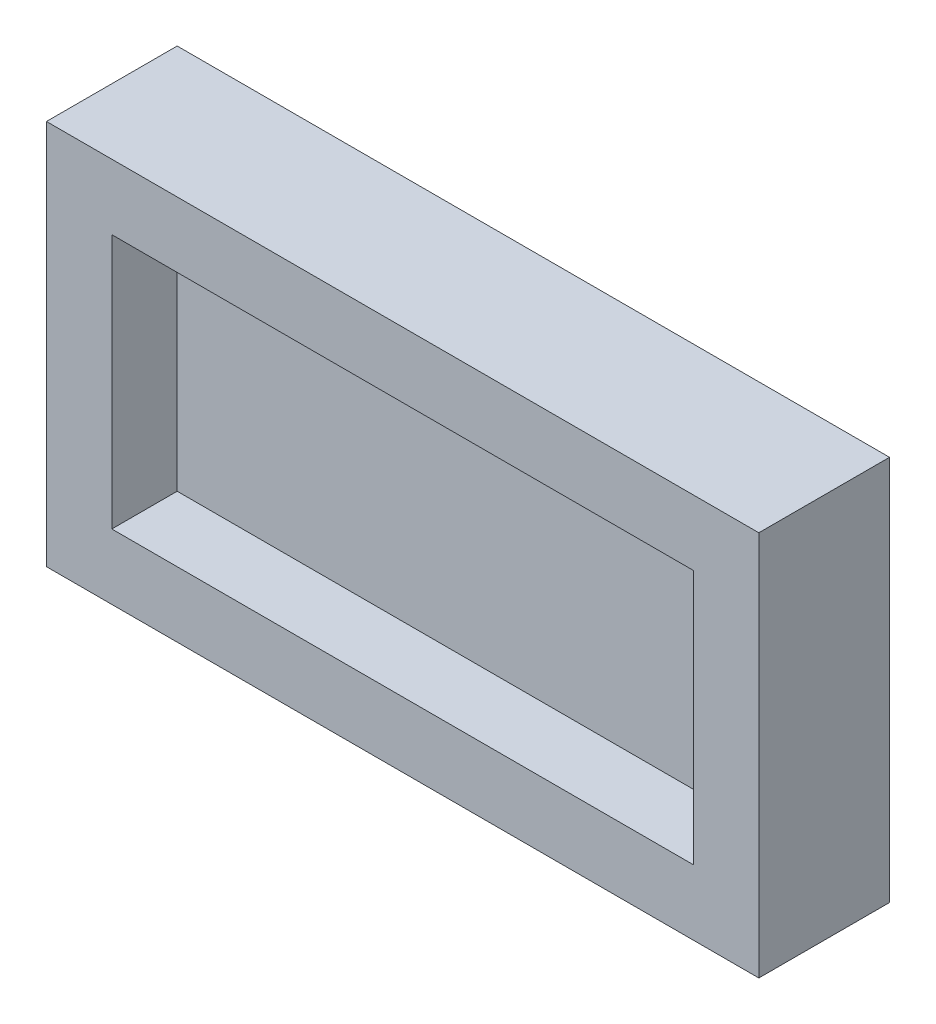
ISO-10303-21;
HEADER;
FILE_DESCRIPTION(('STEP AP214'),'2;1');
FILE_NAME('part.step','',(''),(''),'','','');
FILE_SCHEMA(('AUTOMOTIVE_DESIGN { 1 0 10303 214 1 1 1 1 }'));
ENDSEC;
DATA;
#1=APPLICATION_CONTEXT('core data for automotive mechanical design processes');
#2=APPLICATION_PROTOCOL_DEFINITION('international standard','automotive_design',2000,#1);
#3=PRODUCT_CONTEXT('',#1,'mechanical');
#4=PRODUCT('Part','Part','',(#3));
#5=PRODUCT_RELATED_PRODUCT_CATEGORY('part','',(#4));
#6=PRODUCT_DEFINITION_FORMATION('','',#4);
#7=PRODUCT_DEFINITION_CONTEXT('part definition',#1,'design');
#8=PRODUCT_DEFINITION('design','',#6,#7);
#9=PRODUCT_DEFINITION_SHAPE('','',#8);
#10=(LENGTH_UNIT() NAMED_UNIT(*) SI_UNIT(.MILLI.,.METRE.));
#11=(NAMED_UNIT(*) PLANE_ANGLE_UNIT() SI_UNIT($,.RADIAN.));
#12=(NAMED_UNIT(*) SI_UNIT($,.STERADIAN.) SOLID_ANGLE_UNIT());
#13=UNCERTAINTY_MEASURE_WITH_UNIT(LENGTH_MEASURE(1.E-05),#10,'distance_accuracy_value','');
#14=(GEOMETRIC_REPRESENTATION_CONTEXT(3) GLOBAL_UNCERTAINTY_ASSIGNED_CONTEXT((#13)) GLOBAL_UNIT_ASSIGNED_CONTEXT((#10,
#11,#12)) REPRESENTATION_CONTEXT('',''));
#15=CARTESIAN_POINT('',(0.,0.,0.));
#16=DIRECTION('',(0.,0.,1.));
#17=DIRECTION('',(1.,0.,0.));
#18=AXIS2_PLACEMENT_3D('',#15,#16,#17);
#19=CARTESIAN_POINT('',(0.,0.,10.));
#20=DIRECTION('',(0.,0.,1.));
#21=DIRECTION('',(1.,0.,0.));
#22=AXIS2_PLACEMENT_3D('',#19,#20,#21);
#23=PLANE('',#22);
#24=DIRECTION('',(0.,-1.,0.));
#25=VECTOR('',#24,1.);
#26=CARTESIAN_POINT('',(0.,0.,10.));
#27=LINE('',#26,#25);
#28=CARTESIAN_POINT('',(0.,0.,10.));
#29=VERTEX_POINT('',#28);
#30=CARTESIAN_POINT('',(0.,-59.,10.));
#31=VERTEX_POINT('',#30);
#32=EDGE_CURVE('E189',#29,#31,#27,.T.);
#33=ORIENTED_EDGE('',*,*,#32,.T.);
#34=DIRECTION('',(1.,0.,0.));
#35=VECTOR('',#34,1.);
#36=CARTESIAN_POINT('',(0.,-59.,10.));
#37=LINE('',#36,#35);
#38=CARTESIAN_POINT('',(109.,-59.,10.));
#39=VERTEX_POINT('',#38);
#40=EDGE_CURVE('E192',#31,#39,#37,.T.);
#41=ORIENTED_EDGE('',*,*,#40,.T.);
#42=DIRECTION('',(0.,1.,0.));
#43=VECTOR('',#42,1.);
#44=CARTESIAN_POINT('',(109.,0.,10.));
#45=LINE('',#44,#43);
#46=CARTESIAN_POINT('',(109.,0.,10.));
#47=VERTEX_POINT('',#46);
#48=EDGE_CURVE('E120',#39,#47,#45,.T.);
#49=ORIENTED_EDGE('',*,*,#48,.T.);
#50=DIRECTION('',(-1.,0.,0.));
#51=VECTOR('',#50,1.);
#52=CARTESIAN_POINT('',(0.,0.,10.));
#53=LINE('',#52,#51);
#54=EDGE_CURVE('E70',#47,#29,#53,.T.);
#55=ORIENTED_EDGE('',*,*,#54,.T.);
#56=EDGE_LOOP('',(#33,#41,#49,#55));
#57=FACE_BOUND('',#56,.T.);
#58=DIRECTION('',(1.,0.,0.));
#59=VECTOR('',#58,1.);
#60=CARTESIAN_POINT('',(10.,-49.,10.));
#61=LINE('',#60,#59);
#62=CARTESIAN_POINT('',(10.,-49.,10.));
#63=VERTEX_POINT('',#62);
#64=CARTESIAN_POINT('',(99.,-49.,10.));
#65=VERTEX_POINT('',#64);
#66=EDGE_CURVE('E153',#63,#65,#61,.T.);
#67=ORIENTED_EDGE('',*,*,#66,.F.);
#68=DIRECTION('',(0.,-1.,0.));
#69=VECTOR('',#68,1.);
#70=CARTESIAN_POINT('',(10.,-10.,10.));
#71=LINE('',#70,#69);
#72=CARTESIAN_POINT('',(10.,-10.,10.));
#73=VERTEX_POINT('',#72);
#74=EDGE_CURVE('E150',#73,#63,#71,.T.);
#75=ORIENTED_EDGE('',*,*,#74,.F.);
#76=DIRECTION('',(-1.,0.,0.));
#77=VECTOR('',#76,1.);
#78=CARTESIAN_POINT('',(10.,-10.,10.));
#79=LINE('',#78,#77);
#80=CARTESIAN_POINT('',(99.,-10.,10.));
#81=VERTEX_POINT('',#80);
#82=EDGE_CURVE('E160',#81,#73,#79,.T.);
#83=ORIENTED_EDGE('',*,*,#82,.F.);
#84=DIRECTION('',(0.,1.,0.));
#85=VECTOR('',#84,1.);
#86=CARTESIAN_POINT('',(99.,-10.,10.));
#87=LINE('',#86,#85);
#88=EDGE_CURVE('E157',#65,#81,#87,.T.);
#89=ORIENTED_EDGE('',*,*,#88,.F.);
#90=EDGE_LOOP('',(#67,#75,#83,#89));
#91=FACE_BOUND('',#90,.T.);
#92=ADVANCED_FACE('F45',(#57,#91),#23,.T.);
#93=CARTESIAN_POINT('',(0.,0.,10.));
#94=DIRECTION('',(1.,0.,0.));
#95=DIRECTION('',(0.,1.,0.));
#96=AXIS2_PLACEMENT_3D('',#93,#94,#95);
#97=PLANE('',#96);
#98=DIRECTION('',(0.,0.,-1.));
#99=VECTOR('',#98,1.);
#100=CARTESIAN_POINT('',(0.,0.,10.));
#101=LINE('',#100,#99);
#102=CARTESIAN_POINT('',(0.,0.,-10.));
#103=VERTEX_POINT('',#102);
#104=EDGE_CURVE('E199',#29,#103,#101,.T.);
#105=ORIENTED_EDGE('',*,*,#104,.T.);
#106=DIRECTION('',(0.,1.,0.));
#107=VECTOR('',#106,1.);
#108=CARTESIAN_POINT('',(0.,0.,-10.));
#109=LINE('',#108,#107);
#110=CARTESIAN_POINT('',(0.,-59.,-10.));
#111=VERTEX_POINT('',#110);
#112=EDGE_CURVE('E132',#111,#103,#109,.T.);
#113=ORIENTED_EDGE('',*,*,#112,.F.);
#114=DIRECTION('',(0.,0.,-1.));
#115=VECTOR('',#114,1.);
#116=CARTESIAN_POINT('',(0.,-59.,10.));
#117=LINE('',#116,#115);
#118=EDGE_CURVE('E49',#31,#111,#117,.T.);
#119=ORIENTED_EDGE('',*,*,#118,.F.);
#120=ORIENTED_EDGE('',*,*,#32,.F.);
#121=EDGE_LOOP('',(#105,#113,#119,#120));
#122=FACE_BOUND('',#121,.T.);
#123=ADVANCED_FACE('F47',(#122),#97,.F.);
#124=CARTESIAN_POINT('',(0.,-59.,10.));
#125=DIRECTION('',(0.,1.,0.));
#126=DIRECTION('',(0.,0.,1.));
#127=AXIS2_PLACEMENT_3D('',#124,#125,#126);
#128=PLANE('',#127);
#129=ORIENTED_EDGE('',*,*,#118,.T.);
#130=DIRECTION('',(-1.,0.,0.));
#131=VECTOR('',#130,1.);
#132=CARTESIAN_POINT('',(109.,-59.,-10.));
#133=LINE('',#132,#131);
#134=CARTESIAN_POINT('',(109.,-59.,-10.));
#135=VERTEX_POINT('',#134);
#136=EDGE_CURVE('E125',#135,#111,#133,.T.);
#137=ORIENTED_EDGE('',*,*,#136,.F.);
#138=DIRECTION('',(0.,0.,-1.));
#139=VECTOR('',#138,1.);
#140=CARTESIAN_POINT('',(109.,-59.,10.));
#141=LINE('',#140,#139);
#142=EDGE_CURVE('E114',#39,#135,#141,.T.);
#143=ORIENTED_EDGE('',*,*,#142,.F.);
#144=ORIENTED_EDGE('',*,*,#40,.F.);
#145=EDGE_LOOP('',(#129,#137,#143,#144));
#146=FACE_BOUND('',#145,.T.);
#147=ADVANCED_FACE('F126',(#146),#128,.F.);
#148=CARTESIAN_POINT('',(109.,0.,10.));
#149=DIRECTION('',(-1.,0.,0.));
#150=DIRECTION('',(0.,-1.,0.));
#151=AXIS2_PLACEMENT_3D('',#148,#149,#150);
#152=PLANE('',#151);
#153=ORIENTED_EDGE('',*,*,#142,.T.);
#154=DIRECTION('',(0.,-1.,0.));
#155=VECTOR('',#154,1.);
#156=CARTESIAN_POINT('',(109.,0.,-10.));
#157=LINE('',#156,#155);
#158=CARTESIAN_POINT('',(109.,0.,-10.));
#159=VERTEX_POINT('',#158);
#160=EDGE_CURVE('E119',#159,#135,#157,.T.);
#161=ORIENTED_EDGE('',*,*,#160,.F.);
#162=DIRECTION('',(0.,0.,-1.));
#163=VECTOR('',#162,1.);
#164=CARTESIAN_POINT('',(109.,0.,10.));
#165=LINE('',#164,#163);
#166=EDGE_CURVE('E123',#47,#159,#165,.T.);
#167=ORIENTED_EDGE('',*,*,#166,.F.);
#168=ORIENTED_EDGE('',*,*,#48,.F.);
#169=EDGE_LOOP('',(#153,#161,#167,#168));
#170=FACE_BOUND('',#169,.T.);
#171=ADVANCED_FACE('F116',(#170),#152,.F.);
#172=CARTESIAN_POINT('',(0.,0.,10.));
#173=DIRECTION('',(0.,-1.,0.));
#174=DIRECTION('',(0.,0.,-1.));
#175=AXIS2_PLACEMENT_3D('',#172,#173,#174);
#176=PLANE('',#175);
#177=ORIENTED_EDGE('',*,*,#166,.T.);
#178=DIRECTION('',(1.,0.,0.));
#179=VECTOR('',#178,1.);
#180=CARTESIAN_POINT('',(109.,0.,-10.));
#181=LINE('',#180,#179);
#182=EDGE_CURVE('E137',#103,#159,#181,.T.);
#183=ORIENTED_EDGE('',*,*,#182,.F.);
#184=ORIENTED_EDGE('',*,*,#104,.F.);
#185=ORIENTED_EDGE('',*,*,#54,.F.);
#186=EDGE_LOOP('',(#177,#183,#184,#185));
#187=FACE_BOUND('',#186,.T.);
#188=ADVANCED_FACE('F204',(#187),#176,.F.);
#189=CARTESIAN_POINT('',(10.,-10.,10.));
#190=DIRECTION('',(1.,0.,0.));
#191=DIRECTION('',(0.,1.,0.));
#192=AXIS2_PLACEMENT_3D('',#189,#190,#191);
#193=PLANE('',#192);
#194=DIRECTION('',(0.,-1.,0.));
#195=VECTOR('',#194,1.);
#196=CARTESIAN_POINT('',(10.,-10.,0.));
#197=LINE('',#196,#195);
#198=CARTESIAN_POINT('',(10.,-10.,0.));
#199=VERTEX_POINT('',#198);
#200=CARTESIAN_POINT('',(10.,-49.,0.));
#201=VERTEX_POINT('',#200);
#202=EDGE_CURVE('E149',#199,#201,#197,.T.);
#203=ORIENTED_EDGE('',*,*,#202,.F.);
#204=DIRECTION('',(0.,0.,-1.));
#205=VECTOR('',#204,1.);
#206=CARTESIAN_POINT('',(10.,-10.,10.));
#207=LINE('',#206,#205);
#208=EDGE_CURVE('E163',#73,#199,#207,.T.);
#209=ORIENTED_EDGE('',*,*,#208,.F.);
#210=ORIENTED_EDGE('',*,*,#74,.T.);
#211=DIRECTION('',(0.,0.,-1.));
#212=VECTOR('',#211,1.);
#213=CARTESIAN_POINT('',(10.,-49.,10.));
#214=LINE('',#213,#212);
#215=EDGE_CURVE('E185',#63,#201,#214,.T.);
#216=ORIENTED_EDGE('',*,*,#215,.T.);
#217=EDGE_LOOP('',(#203,#209,#210,#216));
#218=FACE_BOUND('',#217,.T.);
#219=ADVANCED_FACE('F225',(#218),#193,.T.);
#220=CARTESIAN_POINT('',(10.,-49.,10.));
#221=DIRECTION('',(0.,1.,0.));
#222=DIRECTION('',(0.,0.,1.));
#223=AXIS2_PLACEMENT_3D('',#220,#221,#222);
#224=PLANE('',#223);
#225=DIRECTION('',(1.,0.,0.));
#226=VECTOR('',#225,1.);
#227=CARTESIAN_POINT('',(10.,-49.,0.));
#228=LINE('',#227,#226);
#229=CARTESIAN_POINT('',(99.,-49.,0.));
#230=VERTEX_POINT('',#229);
#231=EDGE_CURVE('E167',#201,#230,#228,.T.);
#232=ORIENTED_EDGE('',*,*,#231,.F.);
#233=ORIENTED_EDGE('',*,*,#215,.F.);
#234=ORIENTED_EDGE('',*,*,#66,.T.);
#235=DIRECTION('',(0.,0.,-1.));
#236=VECTOR('',#235,1.);
#237=CARTESIAN_POINT('',(99.,-49.,10.));
#238=LINE('',#237,#236);
#239=EDGE_CURVE('E182',#65,#230,#238,.T.);
#240=ORIENTED_EDGE('',*,*,#239,.T.);
#241=EDGE_LOOP('',(#232,#233,#234,#240));
#242=FACE_BOUND('',#241,.T.);
#243=ADVANCED_FACE('F217',(#242),#224,.T.);
#244=CARTESIAN_POINT('',(99.,-10.,10.));
#245=DIRECTION('',(-1.,0.,0.));
#246=DIRECTION('',(0.,0.,1.));
#247=AXIS2_PLACEMENT_3D('',#244,#245,#246);
#248=PLANE('',#247);
#249=DIRECTION('',(0.,1.,0.));
#250=VECTOR('',#249,1.);
#251=CARTESIAN_POINT('',(99.,-10.,0.));
#252=LINE('',#251,#250);
#253=CARTESIAN_POINT('',(99.,-10.,0.));
#254=VERTEX_POINT('',#253);
#255=EDGE_CURVE('E171',#230,#254,#252,.T.);
#256=ORIENTED_EDGE('',*,*,#255,.F.);
#257=ORIENTED_EDGE('',*,*,#239,.F.);
#258=ORIENTED_EDGE('',*,*,#88,.T.);
#259=DIRECTION('',(0.,0.,-1.));
#260=VECTOR('',#259,1.);
#261=CARTESIAN_POINT('',(99.,-10.,10.));
#262=LINE('',#261,#260);
#263=EDGE_CURVE('E62',#81,#254,#262,.T.);
#264=ORIENTED_EDGE('',*,*,#263,.T.);
#265=EDGE_LOOP('',(#256,#257,#258,#264));
#266=FACE_BOUND('',#265,.T.);
#267=ADVANCED_FACE('F220',(#266),#248,.T.);
#268=CARTESIAN_POINT('',(10.,-10.,10.));
#269=DIRECTION('',(0.,-1.,0.));
#270=DIRECTION('',(0.,0.,-1.));
#271=AXIS2_PLACEMENT_3D('',#268,#269,#270);
#272=PLANE('',#271);
#273=DIRECTION('',(-1.,0.,0.));
#274=VECTOR('',#273,1.);
#275=CARTESIAN_POINT('',(10.,-10.,0.));
#276=LINE('',#275,#274);
#277=EDGE_CURVE('E154',#254,#199,#276,.T.);
#278=ORIENTED_EDGE('',*,*,#277,.F.);
#279=ORIENTED_EDGE('',*,*,#263,.F.);
#280=ORIENTED_EDGE('',*,*,#82,.T.);
#281=ORIENTED_EDGE('',*,*,#208,.T.);
#282=EDGE_LOOP('',(#278,#279,#280,#281));
#283=FACE_BOUND('',#282,.T.);
#284=ADVANCED_FACE('F227',(#283),#272,.T.);
#285=CARTESIAN_POINT('',(0.,0.,0.));
#286=DIRECTION('',(0.,0.,-1.));
#287=DIRECTION('',(-1.,0.,0.));
#288=AXIS2_PLACEMENT_3D('',#285,#286,#287);
#289=PLANE('',#288);
#290=ORIENTED_EDGE('',*,*,#277,.T.);
#291=ORIENTED_EDGE('',*,*,#202,.T.);
#292=ORIENTED_EDGE('',*,*,#231,.T.);
#293=ORIENTED_EDGE('',*,*,#255,.T.);
#294=EDGE_LOOP('',(#290,#291,#292,#293));
#295=FACE_BOUND('',#294,.T.);
#296=ADVANCED_FACE('F222',(#295),#289,.F.);
#297=CARTESIAN_POINT('',(0.,0.,-10.));
#298=DIRECTION('',(0.,0.,-1.));
#299=DIRECTION('',(-1.,0.,0.));
#300=AXIS2_PLACEMENT_3D('',#297,#298,#299);
#301=PLANE('',#300);
#302=CARTESIAN_POINT('',(54.5,-29.5,-10.));
#303=DIRECTION('',(0.,0.,-1.));
#304=DIRECTION('',(-1.,0.,0.));
#305=AXIS2_PLACEMENT_3D('',#302,#303,#304);
#306=CIRCLE('',#305,10.0936840641816);
#307=CARTESIAN_POINT('',(44.4063159358184,-29.5,-10.));
#308=VERTEX_POINT('',#307);
#309=EDGE_CURVE('E11',#308,#308,#306,.T.);
#310=ORIENTED_EDGE('',*,*,#309,.F.);
#311=EDGE_LOOP('',(#310));
#312=FACE_BOUND('',#311,.T.);
#313=ORIENTED_EDGE('',*,*,#160,.T.);
#314=ORIENTED_EDGE('',*,*,#136,.T.);
#315=ORIENTED_EDGE('',*,*,#112,.T.);
#316=ORIENTED_EDGE('',*,*,#182,.T.);
#317=EDGE_LOOP('',(#313,#314,#315,#316));
#318=FACE_BOUND('',#317,.T.);
#319=ADVANCED_FACE('F135',(#312,#318),#301,.T.);
#320=CARTESIAN_POINT('',(54.5,-29.5,-20.));
#321=DIRECTION('',(0.,0.,1.));
#322=DIRECTION('',(1.,0.,0.));
#323=AXIS2_PLACEMENT_3D('',#320,#321,#322);
#324=CYLINDRICAL_SURFACE('',#323,10.0936840641816);
#325=CARTESIAN_POINT('',(54.5,-29.5,-20.));
#326=DIRECTION('',(0.,0.,-1.));
#327=DIRECTION('',(-1.,0.,0.));
#328=AXIS2_PLACEMENT_3D('',#325,#326,#327);
#329=CIRCLE('',#328,10.0936840641816);
#330=CARTESIAN_POINT('',(44.4063159358184,-29.5,-20.));
#331=VERTEX_POINT('',#330);
#332=EDGE_CURVE('E139',#331,#331,#329,.T.);
#333=ORIENTED_EDGE('',*,*,#332,.F.);
#334=EDGE_LOOP('',(#333));
#335=FACE_BOUND('',#334,.T.);
#336=ORIENTED_EDGE('',*,*,#309,.T.);
#337=EDGE_LOOP('',(#336));
#338=FACE_BOUND('',#337,.T.);
#339=ADVANCED_FACE('F319',(#335,#338),#324,.T.);
#340=CARTESIAN_POINT('',(54.5,-29.5,-20.));
#341=DIRECTION('',(0.,0.,-1.));
#342=DIRECTION('',(-1.,0.,0.));
#343=AXIS2_PLACEMENT_3D('',#340,#341,#342);
#344=PLANE('',#343);
#345=ORIENTED_EDGE('',*,*,#332,.T.);
#346=EDGE_LOOP('',(#345));
#347=FACE_BOUND('',#346,.T.);
#348=ADVANCED_FACE('F327',(#347),#344,.T.);
#349=CLOSED_SHELL('',(#92,#123,#147,#171,#188,#219,#243,#267,#284,#296,#319,#339,#348));
#350=MANIFOLD_SOLID_BREP('B2',#349);
#351=ADVANCED_BREP_SHAPE_REPRESENTATION('',(#18,#350),#14);
#352=SHAPE_DEFINITION_REPRESENTATION(#9,#351);
ENDSEC;
END-ISO-10303-21;
